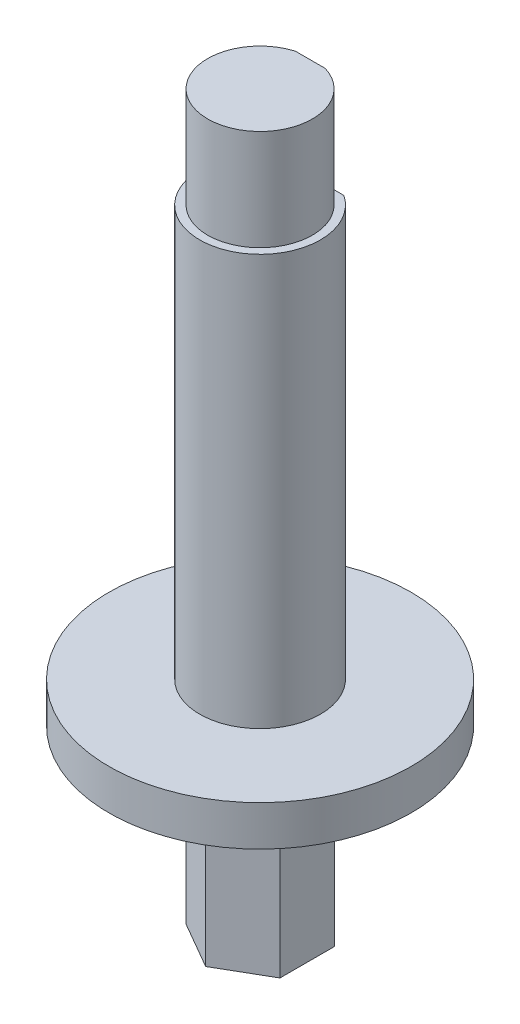
ISO-10303-21;
HEADER;
FILE_DESCRIPTION(('STEP AP214'),'2;1');
FILE_NAME('part.step','',(''),(''),'','','');
FILE_SCHEMA(('AUTOMOTIVE_DESIGN { 1 0 10303 214 1 1 1 1 }'));
ENDSEC;
DATA;
#1=APPLICATION_CONTEXT('core data for automotive mechanical design processes');
#2=APPLICATION_PROTOCOL_DEFINITION('international standard','automotive_design',2000,#1);
#3=PRODUCT_CONTEXT('',#1,'mechanical');
#4=PRODUCT('Part','Part','',(#3));
#5=PRODUCT_RELATED_PRODUCT_CATEGORY('part','',(#4));
#6=PRODUCT_DEFINITION_FORMATION('','',#4);
#7=PRODUCT_DEFINITION_CONTEXT('part definition',#1,'design');
#8=PRODUCT_DEFINITION('design','',#6,#7);
#9=PRODUCT_DEFINITION_SHAPE('','',#8);
#10=(LENGTH_UNIT() NAMED_UNIT(*) SI_UNIT(.MILLI.,.METRE.));
#11=(NAMED_UNIT(*) PLANE_ANGLE_UNIT() SI_UNIT($,.RADIAN.));
#12=(NAMED_UNIT(*) SI_UNIT($,.STERADIAN.) SOLID_ANGLE_UNIT());
#13=UNCERTAINTY_MEASURE_WITH_UNIT(LENGTH_MEASURE(1.E-05),#10,'distance_accuracy_value','');
#14=(GEOMETRIC_REPRESENTATION_CONTEXT(3) GLOBAL_UNCERTAINTY_ASSIGNED_CONTEXT((#13)) GLOBAL_UNIT_ASSIGNED_CONTEXT((#10,
#11,#12)) REPRESENTATION_CONTEXT('',''));
#15=CARTESIAN_POINT('',(0.,0.,0.));
#16=DIRECTION('',(0.,0.,1.));
#17=DIRECTION('',(1.,0.,0.));
#18=AXIS2_PLACEMENT_3D('',#15,#16,#17);
#19=CARTESIAN_POINT('',(2.33826859021798,9.,-1.35));
#20=DIRECTION('',(-0.5,0.,0.866025403784439));
#21=DIRECTION('',(0.866025403784439,0.,0.5));
#22=AXIS2_PLACEMENT_3D('',#19,#20,#21);
#23=PLANE('',#22);
#24=DIRECTION('',(-0.866025403784439,0.,-0.5));
#25=VECTOR('',#24,1.);
#26=CARTESIAN_POINT('',(2.33826859021798,0.,-1.35));
#27=LINE('',#26,#25);
#28=CARTESIAN_POINT('',(2.33826859021798,0.,-1.35));
#29=VERTEX_POINT('',#28);
#30=CARTESIAN_POINT('',(0.,0.,-2.7));
#31=VERTEX_POINT('',#30);
#32=EDGE_CURVE('E147',#29,#31,#27,.T.);
#33=ORIENTED_EDGE('',*,*,#32,.T.);
#34=DIRECTION('',(0.,-1.,0.));
#35=VECTOR('',#34,1.);
#36=CARTESIAN_POINT('',(0.,9.,-2.7));
#37=LINE('',#36,#35);
#38=CARTESIAN_POINT('',(0.,9.,-2.7));
#39=VERTEX_POINT('',#38);
#40=EDGE_CURVE('E42',#39,#31,#37,.T.);
#41=ORIENTED_EDGE('',*,*,#40,.F.);
#42=DIRECTION('',(-0.866025403784439,0.,-0.5));
#43=VECTOR('',#42,1.);
#44=CARTESIAN_POINT('',(2.33826859021798,9.,-1.35));
#45=LINE('',#44,#43);
#46=CARTESIAN_POINT('',(2.33826859021798,9.,-1.35));
#47=VERTEX_POINT('',#46);
#48=EDGE_CURVE('E148',#47,#39,#45,.T.);
#49=ORIENTED_EDGE('',*,*,#48,.F.);
#50=DIRECTION('',(0.,-1.,0.));
#51=VECTOR('',#50,1.);
#52=CARTESIAN_POINT('',(2.33826859021798,9.,-1.35));
#53=LINE('',#52,#51);
#54=EDGE_CURVE('E165',#47,#29,#53,.T.);
#55=ORIENTED_EDGE('',*,*,#54,.T.);
#56=EDGE_LOOP('',(#33,#41,#49,#55));
#57=FACE_BOUND('',#56,.T.);
#58=ADVANCED_FACE('F35',(#57),#23,.F.);
#59=CARTESIAN_POINT('',(0.,9.,-2.7));
#60=DIRECTION('',(0.5,0.,0.866025403784439));
#61=DIRECTION('',(0.866025403784439,0.,-0.5));
#62=AXIS2_PLACEMENT_3D('',#59,#60,#61);
#63=PLANE('',#62);
#64=DIRECTION('',(-0.866025403784439,0.,0.5));
#65=VECTOR('',#64,1.);
#66=CARTESIAN_POINT('',(0.,0.,-2.7));
#67=LINE('',#66,#65);
#68=CARTESIAN_POINT('',(-2.33826859021799,0.,-1.35));
#69=VERTEX_POINT('',#68);
#70=EDGE_CURVE('E168',#31,#69,#67,.T.);
#71=ORIENTED_EDGE('',*,*,#70,.T.);
#72=DIRECTION('',(0.,-1.,0.));
#73=VECTOR('',#72,1.);
#74=CARTESIAN_POINT('',(-2.33826859021799,9.,-1.35));
#75=LINE('',#74,#73);
#76=CARTESIAN_POINT('',(-2.33826859021799,9.,-1.35));
#77=VERTEX_POINT('',#76);
#78=EDGE_CURVE('E188',#77,#69,#75,.T.);
#79=ORIENTED_EDGE('',*,*,#78,.F.);
#80=DIRECTION('',(-0.866025403784439,0.,0.5));
#81=VECTOR('',#80,1.);
#82=CARTESIAN_POINT('',(0.,9.,-2.7));
#83=LINE('',#82,#81);
#84=EDGE_CURVE('E150',#39,#77,#83,.T.);
#85=ORIENTED_EDGE('',*,*,#84,.F.);
#86=ORIENTED_EDGE('',*,*,#40,.T.);
#87=EDGE_LOOP('',(#71,#79,#85,#86));
#88=FACE_BOUND('',#87,.T.);
#89=ADVANCED_FACE('F194',(#88),#63,.F.);
#90=CARTESIAN_POINT('',(-2.33826859021799,9.,-1.35));
#91=DIRECTION('',(1.,0.,0.));
#92=DIRECTION('',(0.,0.,-1.));
#93=AXIS2_PLACEMENT_3D('',#90,#91,#92);
#94=PLANE('',#93);
#95=DIRECTION('',(0.,0.,1.));
#96=VECTOR('',#95,1.);
#97=CARTESIAN_POINT('',(-2.33826859021799,0.,-1.35));
#98=LINE('',#97,#96);
#99=CARTESIAN_POINT('',(-2.33826859021798,0.,1.35));
#100=VERTEX_POINT('',#99);
#101=EDGE_CURVE('E170',#69,#100,#98,.T.);
#102=ORIENTED_EDGE('',*,*,#101,.T.);
#103=DIRECTION('',(0.,-1.,0.));
#104=VECTOR('',#103,1.);
#105=CARTESIAN_POINT('',(-2.33826859021798,9.,1.35));
#106=LINE('',#105,#104);
#107=CARTESIAN_POINT('',(-2.33826859021798,9.,1.35));
#108=VERTEX_POINT('',#107);
#109=EDGE_CURVE('E185',#108,#100,#106,.T.);
#110=ORIENTED_EDGE('',*,*,#109,.F.);
#111=DIRECTION('',(0.,0.,1.));
#112=VECTOR('',#111,1.);
#113=CARTESIAN_POINT('',(-2.33826859021799,9.,-1.35));
#114=LINE('',#113,#112);
#115=EDGE_CURVE('E153',#77,#108,#114,.T.);
#116=ORIENTED_EDGE('',*,*,#115,.F.);
#117=ORIENTED_EDGE('',*,*,#78,.T.);
#118=EDGE_LOOP('',(#102,#110,#116,#117));
#119=FACE_BOUND('',#118,.T.);
#120=ADVANCED_FACE('F206',(#119),#94,.F.);
#121=CARTESIAN_POINT('',(-2.33826859021798,9.,1.35));
#122=DIRECTION('',(0.5,0.,-0.866025403784439));
#123=DIRECTION('',(-0.866025403784439,0.,-0.5));
#124=AXIS2_PLACEMENT_3D('',#121,#122,#123);
#125=PLANE('',#124);
#126=DIRECTION('',(0.866025403784439,0.,0.5));
#127=VECTOR('',#126,1.);
#128=CARTESIAN_POINT('',(-2.33826859021798,0.,1.35));
#129=LINE('',#128,#127);
#130=CARTESIAN_POINT('',(0.,0.,2.7));
#131=VERTEX_POINT('',#130);
#132=EDGE_CURVE('E172',#100,#131,#129,.T.);
#133=ORIENTED_EDGE('',*,*,#132,.T.);
#134=DIRECTION('',(0.,-1.,0.));
#135=VECTOR('',#134,1.);
#136=CARTESIAN_POINT('',(0.,9.,2.7));
#137=LINE('',#136,#135);
#138=CARTESIAN_POINT('',(0.,9.,2.7));
#139=VERTEX_POINT('',#138);
#140=EDGE_CURVE('E182',#139,#131,#137,.T.);
#141=ORIENTED_EDGE('',*,*,#140,.F.);
#142=DIRECTION('',(0.866025403784439,0.,0.5));
#143=VECTOR('',#142,1.);
#144=CARTESIAN_POINT('',(-2.33826859021798,9.,1.35));
#145=LINE('',#144,#143);
#146=EDGE_CURVE('E156',#108,#139,#145,.T.);
#147=ORIENTED_EDGE('',*,*,#146,.F.);
#148=ORIENTED_EDGE('',*,*,#109,.T.);
#149=EDGE_LOOP('',(#133,#141,#147,#148));
#150=FACE_BOUND('',#149,.T.);
#151=ADVANCED_FACE('F210',(#150),#125,.F.);
#152=CARTESIAN_POINT('',(0.,9.,2.7));
#153=DIRECTION('',(-0.5,0.,-0.866025403784439));
#154=DIRECTION('',(-0.866025403784439,0.,0.5));
#155=AXIS2_PLACEMENT_3D('',#152,#153,#154);
#156=PLANE('',#155);
#157=DIRECTION('',(0.866025403784439,0.,-0.5));
#158=VECTOR('',#157,1.);
#159=CARTESIAN_POINT('',(0.,0.,2.7));
#160=LINE('',#159,#158);
#161=CARTESIAN_POINT('',(2.33826859021799,0.,1.35));
#162=VERTEX_POINT('',#161);
#163=EDGE_CURVE('E174',#131,#162,#160,.T.);
#164=ORIENTED_EDGE('',*,*,#163,.T.);
#165=DIRECTION('',(0.,-1.,0.));
#166=VECTOR('',#165,1.);
#167=CARTESIAN_POINT('',(2.33826859021799,9.,1.35));
#168=LINE('',#167,#166);
#169=CARTESIAN_POINT('',(2.33826859021799,9.,1.35));
#170=VERTEX_POINT('',#169);
#171=EDGE_CURVE('E179',#170,#162,#168,.T.);
#172=ORIENTED_EDGE('',*,*,#171,.F.);
#173=DIRECTION('',(0.866025403784439,0.,-0.5));
#174=VECTOR('',#173,1.);
#175=CARTESIAN_POINT('',(0.,9.,2.7));
#176=LINE('',#175,#174);
#177=EDGE_CURVE('E159',#139,#170,#176,.T.);
#178=ORIENTED_EDGE('',*,*,#177,.F.);
#179=ORIENTED_EDGE('',*,*,#140,.T.);
#180=EDGE_LOOP('',(#164,#172,#178,#179));
#181=FACE_BOUND('',#180,.T.);
#182=ADVANCED_FACE('F219',(#181),#156,.F.);
#183=CARTESIAN_POINT('',(2.33826859021799,9.,1.35));
#184=DIRECTION('',(-1.,0.,0.));
#185=DIRECTION('',(0.,0.,1.));
#186=AXIS2_PLACEMENT_3D('',#183,#184,#185);
#187=PLANE('',#186);
#188=DIRECTION('',(0.,0.,-1.));
#189=VECTOR('',#188,1.);
#190=CARTESIAN_POINT('',(2.33826859021799,0.,1.35));
#191=LINE('',#190,#189);
#192=EDGE_CURVE('E151',#162,#29,#191,.T.);
#193=ORIENTED_EDGE('',*,*,#192,.T.);
#194=ORIENTED_EDGE('',*,*,#54,.F.);
#195=DIRECTION('',(0.,0.,-1.));
#196=VECTOR('',#195,1.);
#197=CARTESIAN_POINT('',(2.33826859021799,9.,1.35));
#198=LINE('',#197,#196);
#199=EDGE_CURVE('E162',#170,#47,#198,.T.);
#200=ORIENTED_EDGE('',*,*,#199,.F.);
#201=ORIENTED_EDGE('',*,*,#171,.T.);
#202=EDGE_LOOP('',(#193,#194,#200,#201));
#203=FACE_BOUND('',#202,.T.);
#204=ADVANCED_FACE('F217',(#203),#187,.F.);
#205=CARTESIAN_POINT('',(0.,0.,0.));
#206=DIRECTION('',(0.,1.,0.));
#207=DIRECTION('',(0.,0.,1.));
#208=AXIS2_PLACEMENT_3D('',#205,#206,#207);
#209=PLANE('',#208);
#210=ORIENTED_EDGE('',*,*,#32,.F.);
#211=ORIENTED_EDGE('',*,*,#192,.F.);
#212=ORIENTED_EDGE('',*,*,#163,.F.);
#213=ORIENTED_EDGE('',*,*,#132,.F.);
#214=ORIENTED_EDGE('',*,*,#101,.F.);
#215=ORIENTED_EDGE('',*,*,#70,.F.);
#216=EDGE_LOOP('',(#210,#211,#212,#213,#214,#215));
#217=FACE_BOUND('',#216,.T.);
#218=ADVANCED_FACE('F201',(#217),#209,.F.);
#219=CARTESIAN_POINT('',(0.,9.,0.));
#220=DIRECTION('',(0.,1.,0.));
#221=DIRECTION('',(0.,0.,1.));
#222=AXIS2_PLACEMENT_3D('',#219,#220,#221);
#223=PLANE('',#222);
#224=ORIENTED_EDGE('',*,*,#199,.T.);
#225=ORIENTED_EDGE('',*,*,#48,.T.);
#226=ORIENTED_EDGE('',*,*,#84,.T.);
#227=ORIENTED_EDGE('',*,*,#115,.T.);
#228=ORIENTED_EDGE('',*,*,#146,.T.);
#229=ORIENTED_EDGE('',*,*,#177,.T.);
#230=EDGE_LOOP('',(#224,#225,#226,#227,#228,#229));
#231=FACE_BOUND('',#230,.T.);
#232=CARTESIAN_POINT('',(0.,9.,0.));
#233=DIRECTION('',(0.,-1.,0.));
#234=DIRECTION('',(0.,0.,-1.));
#235=AXIS2_PLACEMENT_3D('',#232,#233,#234);
#236=CIRCLE('',#235,7.5);
#237=CARTESIAN_POINT('',(0.,9.,-7.5));
#238=VERTEX_POINT('',#237);
#239=EDGE_CURVE('E124',#238,#238,#236,.T.);
#240=ORIENTED_EDGE('',*,*,#239,.T.);
#241=EDGE_LOOP('',(#240));
#242=FACE_BOUND('',#241,.T.);
#243=ADVANCED_FACE('F213',(#231,#242),#223,.F.);
#244=CARTESIAN_POINT('',(0.,11.,0.));
#245=DIRECTION('',(0.,-1.,0.));
#246=DIRECTION('',(0.,0.,-1.));
#247=AXIS2_PLACEMENT_3D('',#244,#245,#246);
#248=PLANE('',#247);
#249=CARTESIAN_POINT('',(0.,11.,0.));
#250=DIRECTION('',(0.,-1.,0.));
#251=DIRECTION('',(0.,0.,-1.));
#252=AXIS2_PLACEMENT_3D('',#249,#250,#251);
#253=CIRCLE('',#252,7.5);
#254=CARTESIAN_POINT('',(0.,11.,-7.5));
#255=VERTEX_POINT('',#254);
#256=EDGE_CURVE('E127',#255,#255,#253,.T.);
#257=ORIENTED_EDGE('',*,*,#256,.F.);
#258=EDGE_LOOP('',(#257));
#259=FACE_BOUND('',#258,.T.);
#260=DIRECTION('',(1.,0.,0.));
#261=VECTOR('',#260,1.);
#262=CARTESIAN_POINT('',(-1.66782996839284,11.,-2.49366060171202));
#263=LINE('',#262,#261);
#264=CARTESIAN_POINT('',(-1.66782996839284,11.,-2.49366060171202));
#265=VERTEX_POINT('',#264);
#266=CARTESIAN_POINT('',(1.66782996839284,11.,-2.49366060171202));
#267=VERTEX_POINT('',#266);
#268=EDGE_CURVE('E11',#265,#267,#263,.T.);
#269=ORIENTED_EDGE('',*,*,#268,.T.);
#270=CARTESIAN_POINT('',(0.,11.,0.));
#271=DIRECTION('',(0.,-1.,0.));
#272=DIRECTION('',(0.,0.,-1.));
#273=AXIS2_PLACEMENT_3D('',#270,#271,#272);
#274=CIRCLE('',#273,3.);
#275=EDGE_CURVE('E133',#267,#265,#274,.T.);
#276=ORIENTED_EDGE('',*,*,#275,.T.);
#277=EDGE_LOOP('',(#269,#276));
#278=FACE_BOUND('',#277,.T.);
#279=ADVANCED_FACE('F272',(#259,#278),#248,.F.);
#280=CARTESIAN_POINT('',(0.,11.,0.));
#281=DIRECTION('',(0.,-1.,0.));
#282=DIRECTION('',(0.,0.,-1.));
#283=AXIS2_PLACEMENT_3D('',#280,#281,#282);
#284=CYLINDRICAL_SURFACE('',#283,7.5);
#285=ORIENTED_EDGE('',*,*,#256,.T.);
#286=EDGE_LOOP('',(#285));
#287=FACE_BOUND('',#286,.T.);
#288=ORIENTED_EDGE('',*,*,#239,.F.);
#289=EDGE_LOOP('',(#288));
#290=FACE_BOUND('',#289,.T.);
#291=ADVANCED_FACE('F283',(#287,#290),#284,.T.);
#292=CARTESIAN_POINT('',(0.,31.4,0.));
#293=DIRECTION('',(0.,1.,0.));
#294=DIRECTION('',(0.,0.,1.));
#295=AXIS2_PLACEMENT_3D('',#292,#293,#294);
#296=PLANE('',#295);
#297=CARTESIAN_POINT('',(0.,31.4,0.));
#298=DIRECTION('',(0.,1.,0.));
#299=DIRECTION('',(0.,0.,1.));
#300=AXIS2_PLACEMENT_3D('',#297,#298,#299);
#301=CIRCLE('',#300,2.6);
#302=CARTESIAN_POINT('',(-0.735973371440331,31.4,-2.49366060171202));
#303=VERTEX_POINT('',#302);
#304=CARTESIAN_POINT('',(0.735973371440331,31.4,-2.49366060171202));
#305=VERTEX_POINT('',#304);
#306=EDGE_CURVE('E49',#303,#305,#301,.T.);
#307=ORIENTED_EDGE('',*,*,#306,.F.);
#308=DIRECTION('',(-1.,0.,0.));
#309=VECTOR('',#308,1.);
#310=CARTESIAN_POINT('',(-1.66782996839284,31.4,-2.49366060171202));
#311=LINE('',#310,#309);
#312=CARTESIAN_POINT('',(-1.66782996839284,31.4,-2.49366060171202));
#313=VERTEX_POINT('',#312);
#314=EDGE_CURVE('E140',#303,#313,#311,.T.);
#315=ORIENTED_EDGE('',*,*,#314,.T.);
#316=CARTESIAN_POINT('',(0.,31.4,0.));
#317=DIRECTION('',(0.,1.,0.));
#318=DIRECTION('',(0.,0.,1.));
#319=AXIS2_PLACEMENT_3D('',#316,#317,#318);
#320=CIRCLE('',#319,3.);
#321=CARTESIAN_POINT('',(1.66782996839284,31.4,-2.49366060171202));
#322=VERTEX_POINT('',#321);
#323=EDGE_CURVE('E137',#313,#322,#320,.T.);
#324=ORIENTED_EDGE('',*,*,#323,.T.);
#325=EDGE_CURVE('E141',#322,#305,#311,.T.);
#326=ORIENTED_EDGE('',*,*,#325,.T.);
#327=EDGE_LOOP('',(#307,#315,#324,#326));
#328=FACE_BOUND('',#327,.T.);
#329=ADVANCED_FACE('F293',(#328),#296,.T.);
#330=CARTESIAN_POINT('',(-1.66782996839284,31.4,-2.49366060171202));
#331=DIRECTION('',(0.,0.,1.));
#332=DIRECTION('',(1.,0.,0.));
#333=AXIS2_PLACEMENT_3D('',#330,#331,#332);
#334=PLANE('',#333);
#335=ORIENTED_EDGE('',*,*,#268,.F.);
#336=DIRECTION('',(0.,-1.,0.));
#337=VECTOR('',#336,1.);
#338=CARTESIAN_POINT('',(-1.66782996839284,31.4,-2.49366060171202));
#339=LINE('',#338,#337);
#340=EDGE_CURVE('E143',#313,#265,#339,.T.);
#341=ORIENTED_EDGE('',*,*,#340,.F.);
#342=ORIENTED_EDGE('',*,*,#314,.F.);
#343=DIRECTION('',(0.,-1.,0.));
#344=VECTOR('',#343,1.);
#345=CARTESIAN_POINT('',(-0.735973371440331,36.4,-2.49366060171202));
#346=LINE('',#345,#344);
#347=CARTESIAN_POINT('',(-0.735973371440331,36.4,-2.49366060171202));
#348=VERTEX_POINT('',#347);
#349=EDGE_CURVE('E115',#348,#303,#346,.T.);
#350=ORIENTED_EDGE('',*,*,#349,.F.);
#351=DIRECTION('',(-1.,0.,0.));
#352=VECTOR('',#351,1.);
#353=CARTESIAN_POINT('',(-0.735973371440331,36.4,-2.49366060171202));
#354=LINE('',#353,#352);
#355=CARTESIAN_POINT('',(0.735973371440331,36.4,-2.49366060171202));
#356=VERTEX_POINT('',#355);
#357=EDGE_CURVE('E109',#356,#348,#354,.T.);
#358=ORIENTED_EDGE('',*,*,#357,.F.);
#359=DIRECTION('',(0.,-1.,0.));
#360=VECTOR('',#359,1.);
#361=CARTESIAN_POINT('',(0.735973371440331,36.4,-2.49366060171202));
#362=LINE('',#361,#360);
#363=EDGE_CURVE('E113',#356,#305,#362,.T.);
#364=ORIENTED_EDGE('',*,*,#363,.T.);
#365=ORIENTED_EDGE('',*,*,#325,.F.);
#366=DIRECTION('',(0.,-1.,0.));
#367=VECTOR('',#366,1.);
#368=CARTESIAN_POINT('',(1.66782996839284,31.4,-2.49366060171202));
#369=LINE('',#368,#367);
#370=EDGE_CURVE('E145',#322,#267,#369,.T.);
#371=ORIENTED_EDGE('',*,*,#370,.T.);
#372=EDGE_LOOP('',(#335,#341,#342,#350,#358,#364,#365,#371));
#373=FACE_BOUND('',#372,.T.);
#374=ADVANCED_FACE('F111',(#373),#334,.F.);
#375=CARTESIAN_POINT('',(0.,31.4,0.));
#376=DIRECTION('',(0.,-1.,0.));
#377=DIRECTION('',(0.,0.,-1.));
#378=AXIS2_PLACEMENT_3D('',#375,#376,#377);
#379=CYLINDRICAL_SURFACE('',#378,3.);
#380=ORIENTED_EDGE('',*,*,#275,.F.);
#381=ORIENTED_EDGE('',*,*,#370,.F.);
#382=ORIENTED_EDGE('',*,*,#323,.F.);
#383=ORIENTED_EDGE('',*,*,#340,.T.);
#384=EDGE_LOOP('',(#380,#381,#382,#383));
#385=FACE_BOUND('',#384,.T.);
#386=ADVANCED_FACE('F301',(#385),#379,.T.);
#387=CARTESIAN_POINT('',(0.,36.4,0.));
#388=DIRECTION('',(0.,-1.,0.));
#389=DIRECTION('',(0.,0.,-1.));
#390=AXIS2_PLACEMENT_3D('',#387,#388,#389);
#391=CYLINDRICAL_SURFACE('',#390,2.6);
#392=ORIENTED_EDGE('',*,*,#306,.T.);
#393=ORIENTED_EDGE('',*,*,#363,.F.);
#394=CARTESIAN_POINT('',(0.,36.4,0.));
#395=DIRECTION('',(0.,1.,0.));
#396=DIRECTION('',(0.,0.,1.));
#397=AXIS2_PLACEMENT_3D('',#394,#395,#396);
#398=CIRCLE('',#397,2.6);
#399=EDGE_CURVE('E118',#348,#356,#398,.T.);
#400=ORIENTED_EDGE('',*,*,#399,.F.);
#401=ORIENTED_EDGE('',*,*,#349,.T.);
#402=EDGE_LOOP('',(#392,#393,#400,#401));
#403=FACE_BOUND('',#402,.T.);
#404=ADVANCED_FACE('F123',(#403),#391,.T.);
#405=CARTESIAN_POINT('',(0.,36.4,0.));
#406=DIRECTION('',(0.,1.,0.));
#407=DIRECTION('',(0.,0.,1.));
#408=AXIS2_PLACEMENT_3D('',#405,#406,#407);
#409=PLANE('',#408);
#410=ORIENTED_EDGE('',*,*,#399,.T.);
#411=ORIENTED_EDGE('',*,*,#357,.T.);
#412=EDGE_LOOP('',(#410,#411));
#413=FACE_BOUND('',#412,.T.);
#414=ADVANCED_FACE('F120',(#413),#409,.T.);
#415=CLOSED_SHELL('',(#58,#89,#120,#151,#182,#204,#218,#243,#279,#291,#329,#374,#386,#404,#414));
#416=MANIFOLD_SOLID_BREP('B2',#415);
#417=ADVANCED_BREP_SHAPE_REPRESENTATION('',(#18,#416),#14);
#418=SHAPE_DEFINITION_REPRESENTATION(#9,#417);
ENDSEC;
END-ISO-10303-21;
